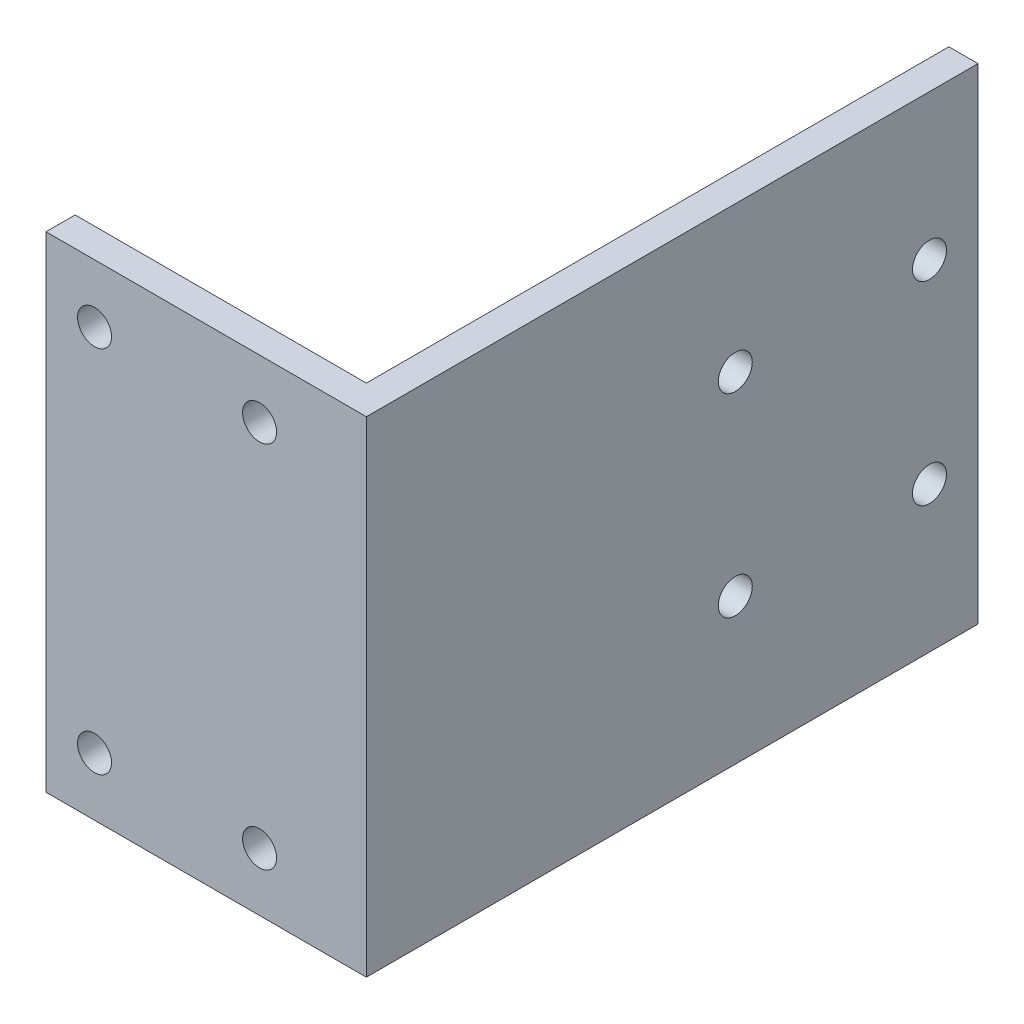
ISO-10303-21;
HEADER;
FILE_DESCRIPTION(('STEP AP214'),'2;1');
FILE_NAME('part.step','',(''),(''),'','','');
FILE_SCHEMA(('AUTOMOTIVE_DESIGN { 1 0 10303 214 1 1 1 1 }'));
ENDSEC;
DATA;
#1=APPLICATION_CONTEXT('core data for automotive mechanical design processes');
#2=APPLICATION_PROTOCOL_DEFINITION('international standard','automotive_design',2000,#1);
#3=PRODUCT_CONTEXT('',#1,'mechanical');
#4=PRODUCT('Part','Part','',(#3));
#5=PRODUCT_RELATED_PRODUCT_CATEGORY('part','',(#4));
#6=PRODUCT_DEFINITION_FORMATION('','',#4);
#7=PRODUCT_DEFINITION_CONTEXT('part definition',#1,'design');
#8=PRODUCT_DEFINITION('design','',#6,#7);
#9=PRODUCT_DEFINITION_SHAPE('','',#8);
#10=(LENGTH_UNIT() NAMED_UNIT(*) SI_UNIT(.MILLI.,.METRE.));
#11=(NAMED_UNIT(*) PLANE_ANGLE_UNIT() SI_UNIT($,.RADIAN.));
#12=(NAMED_UNIT(*) SI_UNIT($,.STERADIAN.) SOLID_ANGLE_UNIT());
#13=UNCERTAINTY_MEASURE_WITH_UNIT(LENGTH_MEASURE(1.E-05),#10,'distance_accuracy_value','');
#14=(GEOMETRIC_REPRESENTATION_CONTEXT(3) GLOBAL_UNCERTAINTY_ASSIGNED_CONTEXT((#13)) GLOBAL_UNIT_ASSIGNED_CONTEXT((#10,
#11,#12)) REPRESENTATION_CONTEXT('',''));
#15=CARTESIAN_POINT('',(0.,0.,0.));
#16=DIRECTION('',(0.,0.,1.));
#17=DIRECTION('',(1.,0.,0.));
#18=AXIS2_PLACEMENT_3D('',#15,#16,#17);
#19=CARTESIAN_POINT('',(0.,50.,3.));
#20=DIRECTION('',(1.,0.,0.));
#21=DIRECTION('',(0.,0.,-1.));
#22=AXIS2_PLACEMENT_3D('',#19,#20,#21);
#23=PLANE('',#22);
#24=DIRECTION('',(0.,0.,1.));
#25=VECTOR('',#24,1.);
#26=CARTESIAN_POINT('',(0.,0.,3.));
#27=LINE('',#26,#25);
#28=CARTESIAN_POINT('',(0.,0.,0.));
#29=VERTEX_POINT('',#28);
#30=CARTESIAN_POINT('',(0.,0.,3.));
#31=VERTEX_POINT('',#30);
#32=EDGE_CURVE('E119',#29,#31,#27,.T.);
#33=ORIENTED_EDGE('',*,*,#32,.T.);
#34=DIRECTION('',(0.,-1.,0.));
#35=VECTOR('',#34,1.);
#36=CARTESIAN_POINT('',(0.,50.,3.));
#37=LINE('',#36,#35);
#38=CARTESIAN_POINT('',(0.,50.,3.));
#39=VERTEX_POINT('',#38);
#40=EDGE_CURVE('E11',#39,#31,#37,.T.);
#41=ORIENTED_EDGE('',*,*,#40,.F.);
#42=DIRECTION('',(0.,0.,1.));
#43=VECTOR('',#42,1.);
#44=CARTESIAN_POINT('',(0.,50.,3.));
#45=LINE('',#44,#43);
#46=CARTESIAN_POINT('',(0.,50.,0.));
#47=VERTEX_POINT('',#46);
#48=EDGE_CURVE('E130',#47,#39,#45,.T.);
#49=ORIENTED_EDGE('',*,*,#48,.F.);
#50=DIRECTION('',(0.,-1.,0.));
#51=VECTOR('',#50,1.);
#52=CARTESIAN_POINT('',(0.,50.,0.));
#53=LINE('',#52,#51);
#54=EDGE_CURVE('E115',#47,#29,#53,.T.);
#55=ORIENTED_EDGE('',*,*,#54,.T.);
#56=EDGE_LOOP('',(#33,#41,#49,#55));
#57=FACE_BOUND('',#56,.T.);
#58=ADVANCED_FACE('F35',(#57),#23,.F.);
#59=CARTESIAN_POINT('',(0.,50.,3.));
#60=DIRECTION('',(0.,0.,-1.));
#61=DIRECTION('',(-1.,0.,0.));
#62=AXIS2_PLACEMENT_3D('',#59,#60,#61);
#63=PLANE('',#62);
#64=CARTESIAN_POINT('',(5.,6.,3.));
#65=DIRECTION('',(0.,0.,-1.));
#66=DIRECTION('',(-1.,0.,0.));
#67=AXIS2_PLACEMENT_3D('',#64,#65,#66);
#68=CIRCLE('',#67,1.75);
#69=CARTESIAN_POINT('',(3.25,6.,3.));
#70=VERTEX_POINT('',#69);
#71=EDGE_CURVE('E319',#70,#70,#68,.T.);
#72=ORIENTED_EDGE('',*,*,#71,.T.);
#73=EDGE_LOOP('',(#72));
#74=FACE_BOUND('',#73,.T.);
#75=CARTESIAN_POINT('',(5.,44.,3.));
#76=DIRECTION('',(0.,0.,-1.));
#77=DIRECTION('',(-1.,0.,0.));
#78=AXIS2_PLACEMENT_3D('',#75,#76,#77);
#79=CIRCLE('',#78,1.75);
#80=CARTESIAN_POINT('',(3.25,44.,3.));
#81=VERTEX_POINT('',#80);
#82=EDGE_CURVE('E314',#81,#81,#79,.T.);
#83=ORIENTED_EDGE('',*,*,#82,.T.);
#84=EDGE_LOOP('',(#83));
#85=FACE_BOUND('',#84,.T.);
#86=CARTESIAN_POINT('',(22.,44.,3.));
#87=DIRECTION('',(0.,0.,-1.));
#88=DIRECTION('',(-1.,0.,0.));
#89=AXIS2_PLACEMENT_3D('',#86,#87,#88);
#90=CIRCLE('',#89,1.75);
#91=CARTESIAN_POINT('',(20.25,44.,3.));
#92=VERTEX_POINT('',#91);
#93=EDGE_CURVE('E304',#92,#92,#90,.T.);
#94=ORIENTED_EDGE('',*,*,#93,.T.);
#95=EDGE_LOOP('',(#94));
#96=FACE_BOUND('',#95,.T.);
#97=CARTESIAN_POINT('',(22.,6.,3.));
#98=DIRECTION('',(0.,0.,-1.));
#99=DIRECTION('',(-1.,0.,0.));
#100=AXIS2_PLACEMENT_3D('',#97,#98,#99);
#101=CIRCLE('',#100,1.75);
#102=CARTESIAN_POINT('',(20.25,6.,3.));
#103=VERTEX_POINT('',#102);
#104=EDGE_CURVE('E123',#103,#103,#101,.T.);
#105=ORIENTED_EDGE('',*,*,#104,.T.);
#106=EDGE_LOOP('',(#105));
#107=FACE_BOUND('',#106,.T.);
#108=DIRECTION('',(1.,0.,0.));
#109=VECTOR('',#108,1.);
#110=CARTESIAN_POINT('',(0.,0.,3.));
#111=LINE('',#110,#109);
#112=CARTESIAN_POINT('',(33.,0.,3.));
#113=VERTEX_POINT('',#112);
#114=EDGE_CURVE('E122',#31,#113,#111,.T.);
#115=ORIENTED_EDGE('',*,*,#114,.T.);
#116=DIRECTION('',(0.,-1.,0.));
#117=VECTOR('',#116,1.);
#118=CARTESIAN_POINT('',(33.,50.,3.));
#119=LINE('',#118,#117);
#120=CARTESIAN_POINT('',(33.,50.,3.));
#121=VERTEX_POINT('',#120);
#122=EDGE_CURVE('E43',#121,#113,#119,.T.);
#123=ORIENTED_EDGE('',*,*,#122,.F.);
#124=DIRECTION('',(1.,0.,0.));
#125=VECTOR('',#124,1.);
#126=CARTESIAN_POINT('',(0.,50.,3.));
#127=LINE('',#126,#125);
#128=EDGE_CURVE('E88',#39,#121,#127,.T.);
#129=ORIENTED_EDGE('',*,*,#128,.F.);
#130=ORIENTED_EDGE('',*,*,#40,.T.);
#131=EDGE_LOOP('',(#115,#123,#129,#130));
#132=FACE_BOUND('',#131,.T.);
#133=ADVANCED_FACE('F159',(#74,#85,#96,#107,#132),#63,.F.);
#134=CARTESIAN_POINT('',(33.,50.,3.));
#135=DIRECTION('',(-1.,0.,0.));
#136=DIRECTION('',(0.,0.,1.));
#137=AXIS2_PLACEMENT_3D('',#134,#135,#136);
#138=PLANE('',#137);
#139=CARTESIAN_POINT('',(33.,15.,-35.));
#140=DIRECTION('',(1.,0.,0.));
#141=DIRECTION('',(0.,0.,-1.));
#142=AXIS2_PLACEMENT_3D('',#139,#140,#141);
#143=CIRCLE('',#142,1.75);
#144=CARTESIAN_POINT('',(33.,15.,-36.75));
#145=VERTEX_POINT('',#144);
#146=EDGE_CURVE('E347',#145,#145,#143,.T.);
#147=ORIENTED_EDGE('',*,*,#146,.F.);
#148=EDGE_LOOP('',(#147));
#149=FACE_BOUND('',#148,.T.);
#150=CARTESIAN_POINT('',(33.,35.,-35.));
#151=DIRECTION('',(1.,0.,0.));
#152=DIRECTION('',(0.,0.,-1.));
#153=AXIS2_PLACEMENT_3D('',#150,#151,#152);
#154=CIRCLE('',#153,1.75);
#155=CARTESIAN_POINT('',(33.,35.,-36.75));
#156=VERTEX_POINT('',#155);
#157=EDGE_CURVE('E341',#156,#156,#154,.T.);
#158=ORIENTED_EDGE('',*,*,#157,.F.);
#159=EDGE_LOOP('',(#158));
#160=FACE_BOUND('',#159,.T.);
#161=CARTESIAN_POINT('',(33.,15.,-55.));
#162=DIRECTION('',(1.,0.,0.));
#163=DIRECTION('',(0.,0.,-1.));
#164=AXIS2_PLACEMENT_3D('',#161,#162,#163);
#165=CIRCLE('',#164,1.75);
#166=CARTESIAN_POINT('',(33.,15.,-56.75));
#167=VERTEX_POINT('',#166);
#168=EDGE_CURVE('E335',#167,#167,#165,.T.);
#169=ORIENTED_EDGE('',*,*,#168,.F.);
#170=EDGE_LOOP('',(#169));
#171=FACE_BOUND('',#170,.T.);
#172=CARTESIAN_POINT('',(33.,35.,-55.));
#173=DIRECTION('',(1.,0.,0.));
#174=DIRECTION('',(0.,0.,-1.));
#175=AXIS2_PLACEMENT_3D('',#172,#173,#174);
#176=CIRCLE('',#175,1.75);
#177=CARTESIAN_POINT('',(33.,35.,-56.75));
#178=VERTEX_POINT('',#177);
#179=EDGE_CURVE('E329',#178,#178,#176,.T.);
#180=ORIENTED_EDGE('',*,*,#179,.F.);
#181=EDGE_LOOP('',(#180));
#182=FACE_BOUND('',#181,.T.);
#183=DIRECTION('',(0.,0.,-1.));
#184=VECTOR('',#183,1.);
#185=CARTESIAN_POINT('',(33.,0.,3.));
#186=LINE('',#185,#184);
#187=CARTESIAN_POINT('',(33.,0.,-60.));
#188=VERTEX_POINT('',#187);
#189=EDGE_CURVE('E125',#113,#188,#186,.T.);
#190=ORIENTED_EDGE('',*,*,#189,.T.);
#191=DIRECTION('',(0.,-1.,0.));
#192=VECTOR('',#191,1.);
#193=CARTESIAN_POINT('',(33.,50.,-60.));
#194=LINE('',#193,#192);
#195=CARTESIAN_POINT('',(33.,50.,-60.));
#196=VERTEX_POINT('',#195);
#197=EDGE_CURVE('E110',#196,#188,#194,.T.);
#198=ORIENTED_EDGE('',*,*,#197,.F.);
#199=DIRECTION('',(0.,0.,-1.));
#200=VECTOR('',#199,1.);
#201=CARTESIAN_POINT('',(33.,50.,3.));
#202=LINE('',#201,#200);
#203=EDGE_CURVE('E101',#121,#196,#202,.T.);
#204=ORIENTED_EDGE('',*,*,#203,.F.);
#205=ORIENTED_EDGE('',*,*,#122,.T.);
#206=EDGE_LOOP('',(#190,#198,#204,#205));
#207=FACE_BOUND('',#206,.T.);
#208=ADVANCED_FACE('F136',(#149,#160,#171,#182,#207),#138,.F.);
#209=CARTESIAN_POINT('',(30.,50.,-60.));
#210=DIRECTION('',(0.,0.,1.));
#211=DIRECTION('',(1.,0.,0.));
#212=AXIS2_PLACEMENT_3D('',#209,#210,#211);
#213=PLANE('',#212);
#214=DIRECTION('',(-1.,0.,0.));
#215=VECTOR('',#214,1.);
#216=CARTESIAN_POINT('',(30.,0.,-60.));
#217=LINE('',#216,#215);
#218=CARTESIAN_POINT('',(30.,0.,-60.));
#219=VERTEX_POINT('',#218);
#220=EDGE_CURVE('E109',#188,#219,#217,.T.);
#221=ORIENTED_EDGE('',*,*,#220,.T.);
#222=DIRECTION('',(0.,-1.,0.));
#223=VECTOR('',#222,1.);
#224=CARTESIAN_POINT('',(30.,50.,-60.));
#225=LINE('',#224,#223);
#226=CARTESIAN_POINT('',(30.,50.,-60.));
#227=VERTEX_POINT('',#226);
#228=EDGE_CURVE('E106',#227,#219,#225,.T.);
#229=ORIENTED_EDGE('',*,*,#228,.F.);
#230=DIRECTION('',(-1.,0.,0.));
#231=VECTOR('',#230,1.);
#232=CARTESIAN_POINT('',(30.,50.,-60.));
#233=LINE('',#232,#231);
#234=EDGE_CURVE('E95',#196,#227,#233,.T.);
#235=ORIENTED_EDGE('',*,*,#234,.F.);
#236=ORIENTED_EDGE('',*,*,#197,.T.);
#237=EDGE_LOOP('',(#221,#229,#235,#236));
#238=FACE_BOUND('',#237,.T.);
#239=ADVANCED_FACE('F107',(#238),#213,.F.);
#240=CARTESIAN_POINT('',(30.,50.,0.));
#241=DIRECTION('',(1.,0.,0.));
#242=DIRECTION('',(0.,0.,-1.));
#243=AXIS2_PLACEMENT_3D('',#240,#241,#242);
#244=PLANE('',#243);
#245=CARTESIAN_POINT('',(30.,15.,-35.));
#246=DIRECTION('',(1.,0.,0.));
#247=DIRECTION('',(0.,0.,-1.));
#248=AXIS2_PLACEMENT_3D('',#245,#246,#247);
#249=CIRCLE('',#248,1.75);
#250=CARTESIAN_POINT('',(30.,15.,-36.75));
#251=VERTEX_POINT('',#250);
#252=EDGE_CURVE('E344',#251,#251,#249,.F.);
#253=ORIENTED_EDGE('',*,*,#252,.F.);
#254=EDGE_LOOP('',(#253));
#255=FACE_BOUND('',#254,.T.);
#256=CARTESIAN_POINT('',(30.,35.,-35.));
#257=DIRECTION('',(1.,0.,0.));
#258=DIRECTION('',(0.,0.,-1.));
#259=AXIS2_PLACEMENT_3D('',#256,#257,#258);
#260=CIRCLE('',#259,1.75);
#261=CARTESIAN_POINT('',(30.,35.,-36.75));
#262=VERTEX_POINT('',#261);
#263=EDGE_CURVE('E338',#262,#262,#260,.F.);
#264=ORIENTED_EDGE('',*,*,#263,.F.);
#265=EDGE_LOOP('',(#264));
#266=FACE_BOUND('',#265,.T.);
#267=CARTESIAN_POINT('',(30.,15.,-55.));
#268=DIRECTION('',(1.,0.,0.));
#269=DIRECTION('',(0.,0.,-1.));
#270=AXIS2_PLACEMENT_3D('',#267,#268,#269);
#271=CIRCLE('',#270,1.75);
#272=CARTESIAN_POINT('',(30.,15.,-56.75));
#273=VERTEX_POINT('',#272);
#274=EDGE_CURVE('E332',#273,#273,#271,.F.);
#275=ORIENTED_EDGE('',*,*,#274,.F.);
#276=EDGE_LOOP('',(#275));
#277=FACE_BOUND('',#276,.T.);
#278=CARTESIAN_POINT('',(30.,35.,-55.));
#279=DIRECTION('',(1.,0.,0.));
#280=DIRECTION('',(0.,0.,-1.));
#281=AXIS2_PLACEMENT_3D('',#278,#279,#280);
#282=CIRCLE('',#281,1.75);
#283=CARTESIAN_POINT('',(30.,35.,-56.75));
#284=VERTEX_POINT('',#283);
#285=EDGE_CURVE('E325',#284,#284,#282,.F.);
#286=ORIENTED_EDGE('',*,*,#285,.F.);
#287=EDGE_LOOP('',(#286));
#288=FACE_BOUND('',#287,.T.);
#289=DIRECTION('',(0.,0.,1.));
#290=VECTOR('',#289,1.);
#291=CARTESIAN_POINT('',(30.,0.,0.));
#292=LINE('',#291,#290);
#293=CARTESIAN_POINT('',(30.,0.,0.));
#294=VERTEX_POINT('',#293);
#295=EDGE_CURVE('E74',#219,#294,#292,.T.);
#296=ORIENTED_EDGE('',*,*,#295,.T.);
#297=DIRECTION('',(0.,-1.,0.));
#298=VECTOR('',#297,1.);
#299=CARTESIAN_POINT('',(30.,50.,0.));
#300=LINE('',#299,#298);
#301=CARTESIAN_POINT('',(30.,50.,0.));
#302=VERTEX_POINT('',#301);
#303=EDGE_CURVE('E111',#302,#294,#300,.T.);
#304=ORIENTED_EDGE('',*,*,#303,.F.);
#305=DIRECTION('',(0.,0.,1.));
#306=VECTOR('',#305,1.);
#307=CARTESIAN_POINT('',(30.,50.,0.));
#308=LINE('',#307,#306);
#309=EDGE_CURVE('E99',#227,#302,#308,.T.);
#310=ORIENTED_EDGE('',*,*,#309,.F.);
#311=ORIENTED_EDGE('',*,*,#228,.T.);
#312=EDGE_LOOP('',(#296,#304,#310,#311));
#313=FACE_BOUND('',#312,.T.);
#314=ADVANCED_FACE('F113',(#255,#266,#277,#288,#313),#244,.F.);
#315=CARTESIAN_POINT('',(0.,50.,0.));
#316=DIRECTION('',(0.,0.,1.));
#317=DIRECTION('',(1.,0.,0.));
#318=AXIS2_PLACEMENT_3D('',#315,#316,#317);
#319=PLANE('',#318);
#320=CARTESIAN_POINT('',(5.,6.,0.));
#321=DIRECTION('',(0.,0.,-1.));
#322=DIRECTION('',(-1.,0.,0.));
#323=AXIS2_PLACEMENT_3D('',#320,#321,#322);
#324=CIRCLE('',#323,1.75);
#325=CARTESIAN_POINT('',(3.25,6.,0.));
#326=VERTEX_POINT('',#325);
#327=EDGE_CURVE('E322',#326,#326,#324,.T.);
#328=ORIENTED_EDGE('',*,*,#327,.F.);
#329=EDGE_LOOP('',(#328));
#330=FACE_BOUND('',#329,.T.);
#331=CARTESIAN_POINT('',(5.,44.,0.));
#332=DIRECTION('',(0.,0.,-1.));
#333=DIRECTION('',(-1.,0.,0.));
#334=AXIS2_PLACEMENT_3D('',#331,#332,#333);
#335=CIRCLE('',#334,1.75);
#336=CARTESIAN_POINT('',(3.25,44.,0.));
#337=VERTEX_POINT('',#336);
#338=EDGE_CURVE('E316',#337,#337,#335,.T.);
#339=ORIENTED_EDGE('',*,*,#338,.F.);
#340=EDGE_LOOP('',(#339));
#341=FACE_BOUND('',#340,.T.);
#342=CARTESIAN_POINT('',(22.,44.,0.));
#343=DIRECTION('',(0.,0.,-1.));
#344=DIRECTION('',(-1.,0.,0.));
#345=AXIS2_PLACEMENT_3D('',#342,#343,#344);
#346=CIRCLE('',#345,1.75);
#347=CARTESIAN_POINT('',(20.25,44.,0.));
#348=VERTEX_POINT('',#347);
#349=EDGE_CURVE('E308',#348,#348,#346,.T.);
#350=ORIENTED_EDGE('',*,*,#349,.F.);
#351=EDGE_LOOP('',(#350));
#352=FACE_BOUND('',#351,.T.);
#353=CARTESIAN_POINT('',(22.,6.,0.));
#354=DIRECTION('',(0.,0.,-1.));
#355=DIRECTION('',(-1.,0.,0.));
#356=AXIS2_PLACEMENT_3D('',#353,#354,#355);
#357=CIRCLE('',#356,1.75);
#358=CARTESIAN_POINT('',(20.25,6.,0.));
#359=VERTEX_POINT('',#358);
#360=EDGE_CURVE('E302',#359,#359,#357,.T.);
#361=ORIENTED_EDGE('',*,*,#360,.F.);
#362=EDGE_LOOP('',(#361));
#363=FACE_BOUND('',#362,.T.);
#364=DIRECTION('',(-1.,0.,0.));
#365=VECTOR('',#364,1.);
#366=CARTESIAN_POINT('',(0.,0.,0.));
#367=LINE('',#366,#365);
#368=EDGE_CURVE('E80',#294,#29,#367,.T.);
#369=ORIENTED_EDGE('',*,*,#368,.T.);
#370=ORIENTED_EDGE('',*,*,#54,.F.);
#371=DIRECTION('',(-1.,0.,0.));
#372=VECTOR('',#371,1.);
#373=CARTESIAN_POINT('',(0.,50.,0.));
#374=LINE('',#373,#372);
#375=EDGE_CURVE('E51',#302,#47,#374,.T.);
#376=ORIENTED_EDGE('',*,*,#375,.F.);
#377=ORIENTED_EDGE('',*,*,#303,.T.);
#378=EDGE_LOOP('',(#369,#370,#376,#377));
#379=FACE_BOUND('',#378,.T.);
#380=ADVANCED_FACE('F143',(#330,#341,#352,#363,#379),#319,.F.);
#381=CARTESIAN_POINT('',(0.,50.,0.));
#382=DIRECTION('',(0.,-1.,0.));
#383=DIRECTION('',(0.,0.,-1.));
#384=AXIS2_PLACEMENT_3D('',#381,#382,#383);
#385=PLANE('',#384);
#386=ORIENTED_EDGE('',*,*,#48,.T.);
#387=ORIENTED_EDGE('',*,*,#128,.T.);
#388=ORIENTED_EDGE('',*,*,#203,.T.);
#389=ORIENTED_EDGE('',*,*,#234,.T.);
#390=ORIENTED_EDGE('',*,*,#309,.T.);
#391=ORIENTED_EDGE('',*,*,#375,.T.);
#392=EDGE_LOOP('',(#386,#387,#388,#389,#390,#391));
#393=FACE_BOUND('',#392,.T.);
#394=ADVANCED_FACE('F97',(#393),#385,.F.);
#395=CARTESIAN_POINT('',(0.,0.,0.));
#396=DIRECTION('',(0.,-1.,0.));
#397=DIRECTION('',(0.,0.,-1.));
#398=AXIS2_PLACEMENT_3D('',#395,#396,#397);
#399=PLANE('',#398);
#400=ORIENTED_EDGE('',*,*,#32,.F.);
#401=ORIENTED_EDGE('',*,*,#368,.F.);
#402=ORIENTED_EDGE('',*,*,#295,.F.);
#403=ORIENTED_EDGE('',*,*,#220,.F.);
#404=ORIENTED_EDGE('',*,*,#189,.F.);
#405=ORIENTED_EDGE('',*,*,#114,.F.);
#406=EDGE_LOOP('',(#400,#401,#402,#403,#404,#405));
#407=FACE_BOUND('',#406,.T.);
#408=ADVANCED_FACE('F139',(#407),#399,.T.);
#409=CARTESIAN_POINT('',(22.,6.,3.));
#410=DIRECTION('',(0.,0.,-1.));
#411=DIRECTION('',(-1.,0.,0.));
#412=AXIS2_PLACEMENT_3D('',#409,#410,#411);
#413=CYLINDRICAL_SURFACE('',#412,1.75);
#414=ORIENTED_EDGE('',*,*,#104,.F.);
#415=EDGE_LOOP('',(#414));
#416=FACE_BOUND('',#415,.T.);
#417=ORIENTED_EDGE('',*,*,#360,.T.);
#418=EDGE_LOOP('',(#417));
#419=FACE_BOUND('',#418,.T.);
#420=ADVANCED_FACE('F244',(#416,#419),#413,.F.);
#421=CARTESIAN_POINT('',(22.,44.,3.));
#422=DIRECTION('',(0.,0.,-1.));
#423=DIRECTION('',(-1.,0.,0.));
#424=AXIS2_PLACEMENT_3D('',#421,#422,#423);
#425=CYLINDRICAL_SURFACE('',#424,1.75);
#426=ORIENTED_EDGE('',*,*,#93,.F.);
#427=EDGE_LOOP('',(#426));
#428=FACE_BOUND('',#427,.T.);
#429=ORIENTED_EDGE('',*,*,#349,.T.);
#430=EDGE_LOOP('',(#429));
#431=FACE_BOUND('',#430,.T.);
#432=ADVANCED_FACE('F240',(#428,#431),#425,.F.);
#433=CARTESIAN_POINT('',(5.,44.,3.));
#434=DIRECTION('',(0.,0.,-1.));
#435=DIRECTION('',(-1.,0.,0.));
#436=AXIS2_PLACEMENT_3D('',#433,#434,#435);
#437=CYLINDRICAL_SURFACE('',#436,1.75);
#438=ORIENTED_EDGE('',*,*,#82,.F.);
#439=EDGE_LOOP('',(#438));
#440=FACE_BOUND('',#439,.T.);
#441=ORIENTED_EDGE('',*,*,#338,.T.);
#442=EDGE_LOOP('',(#441));
#443=FACE_BOUND('',#442,.T.);
#444=ADVANCED_FACE('F236',(#440,#443),#437,.F.);
#445=CARTESIAN_POINT('',(5.,6.,3.));
#446=DIRECTION('',(0.,0.,-1.));
#447=DIRECTION('',(-1.,0.,0.));
#448=AXIS2_PLACEMENT_3D('',#445,#446,#447);
#449=CYLINDRICAL_SURFACE('',#448,1.75);
#450=ORIENTED_EDGE('',*,*,#71,.F.);
#451=EDGE_LOOP('',(#450));
#452=FACE_BOUND('',#451,.T.);
#453=ORIENTED_EDGE('',*,*,#327,.T.);
#454=EDGE_LOOP('',(#453));
#455=FACE_BOUND('',#454,.T.);
#456=ADVANCED_FACE('F196',(#452,#455),#449,.F.);
#457=CARTESIAN_POINT('',(-0.00100000000001488,35.,-55.));
#458=DIRECTION('',(1.,0.,0.));
#459=DIRECTION('',(0.,0.,-1.));
#460=AXIS2_PLACEMENT_3D('',#457,#458,#459);
#461=CYLINDRICAL_SURFACE('',#460,1.75);
#462=ORIENTED_EDGE('',*,*,#179,.T.);
#463=EDGE_LOOP('',(#462));
#464=FACE_BOUND('',#463,.T.);
#465=ORIENTED_EDGE('',*,*,#285,.T.);
#466=EDGE_LOOP('',(#465));
#467=FACE_BOUND('',#466,.T.);
#468=ADVANCED_FACE('F190',(#464,#467),#461,.F.);
#469=CARTESIAN_POINT('',(-0.00100000000001488,15.,-55.));
#470=DIRECTION('',(1.,0.,0.));
#471=DIRECTION('',(0.,0.,-1.));
#472=AXIS2_PLACEMENT_3D('',#469,#470,#471);
#473=CYLINDRICAL_SURFACE('',#472,1.75);
#474=ORIENTED_EDGE('',*,*,#168,.T.);
#475=EDGE_LOOP('',(#474));
#476=FACE_BOUND('',#475,.T.);
#477=ORIENTED_EDGE('',*,*,#274,.T.);
#478=EDGE_LOOP('',(#477));
#479=FACE_BOUND('',#478,.T.);
#480=ADVANCED_FACE('F195',(#476,#479),#473,.F.);
#481=CARTESIAN_POINT('',(-0.00100000000000794,35.,-35.));
#482=DIRECTION('',(1.,0.,0.));
#483=DIRECTION('',(0.,0.,-1.));
#484=AXIS2_PLACEMENT_3D('',#481,#482,#483);
#485=CYLINDRICAL_SURFACE('',#484,1.75);
#486=ORIENTED_EDGE('',*,*,#157,.T.);
#487=EDGE_LOOP('',(#486));
#488=FACE_BOUND('',#487,.T.);
#489=ORIENTED_EDGE('',*,*,#263,.T.);
#490=EDGE_LOOP('',(#489));
#491=FACE_BOUND('',#490,.T.);
#492=ADVANCED_FACE('F208',(#488,#491),#485,.F.);
#493=CARTESIAN_POINT('',(-0.00100000000000794,15.,-35.));
#494=DIRECTION('',(1.,0.,0.));
#495=DIRECTION('',(0.,0.,-1.));
#496=AXIS2_PLACEMENT_3D('',#493,#494,#495);
#497=CYLINDRICAL_SURFACE('',#496,1.75);
#498=ORIENTED_EDGE('',*,*,#146,.T.);
#499=EDGE_LOOP('',(#498));
#500=FACE_BOUND('',#499,.T.);
#501=ORIENTED_EDGE('',*,*,#252,.T.);
#502=EDGE_LOOP('',(#501));
#503=FACE_BOUND('',#502,.T.);
#504=ADVANCED_FACE('F218',(#500,#503),#497,.F.);
#505=CLOSED_SHELL('',(#58,#133,#208,#239,#314,#380,#394,#408,#420,#432,#444,#456,#468,#480,#492,#504));
#506=MANIFOLD_SOLID_BREP('B2',#505);
#507=ADVANCED_BREP_SHAPE_REPRESENTATION('',(#18,#506),#14);
#508=SHAPE_DEFINITION_REPRESENTATION(#9,#507);
ENDSEC;
END-ISO-10303-21;
